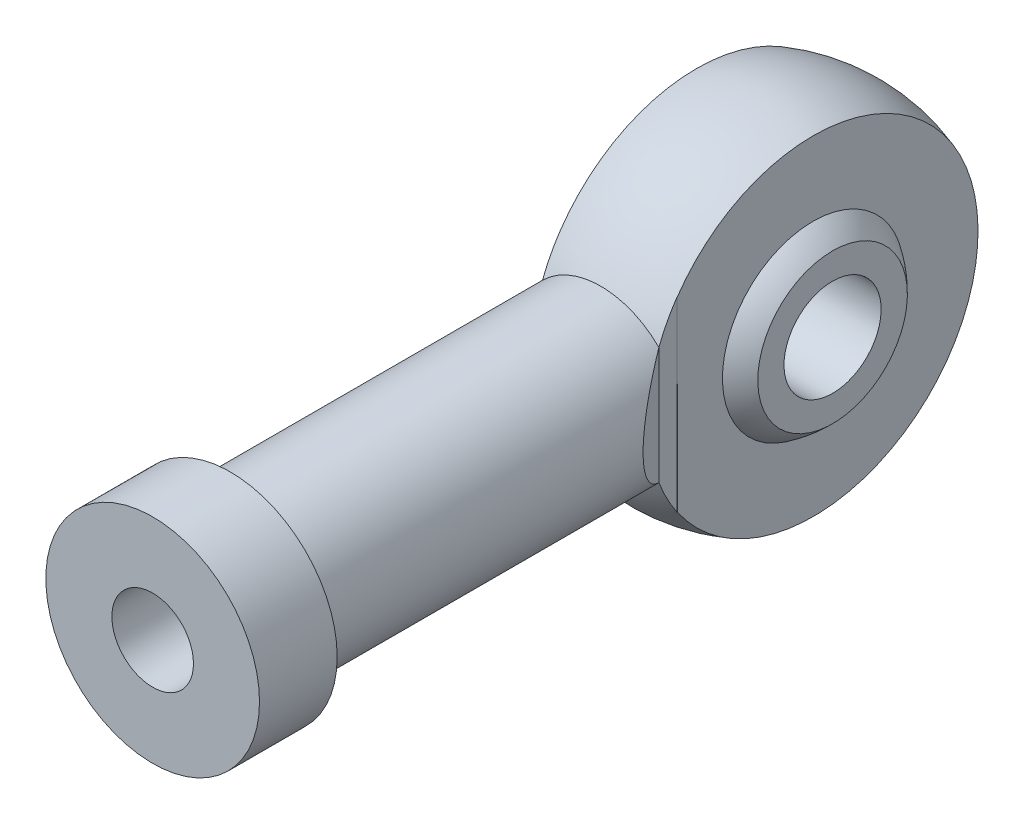
ISO-10303-21;
HEADER;
FILE_DESCRIPTION(('STEP AP214'),'2;1');
FILE_NAME('part.step','',(''),(''),'','','');
FILE_SCHEMA(('AUTOMOTIVE_DESIGN { 1 0 10303 214 1 1 1 1 }'));
ENDSEC;
DATA;
#1=APPLICATION_CONTEXT('core data for automotive mechanical design processes');
#2=APPLICATION_PROTOCOL_DEFINITION('international standard','automotive_design',2000,#1);
#3=PRODUCT_CONTEXT('',#1,'mechanical');
#4=PRODUCT('Part','Part','',(#3));
#5=PRODUCT_RELATED_PRODUCT_CATEGORY('part','',(#4));
#6=PRODUCT_DEFINITION_FORMATION('','',#4);
#7=PRODUCT_DEFINITION_CONTEXT('part definition',#1,'design');
#8=PRODUCT_DEFINITION('design','',#6,#7);
#9=PRODUCT_DEFINITION_SHAPE('','',#8);
#10=(LENGTH_UNIT() NAMED_UNIT(*) SI_UNIT(.MILLI.,.METRE.));
#11=(NAMED_UNIT(*) PLANE_ANGLE_UNIT() SI_UNIT($,.RADIAN.));
#12=(NAMED_UNIT(*) SI_UNIT($,.STERADIAN.) SOLID_ANGLE_UNIT());
#13=UNCERTAINTY_MEASURE_WITH_UNIT(LENGTH_MEASURE(1.E-05),#10,'distance_accuracy_value','');
#14=(GEOMETRIC_REPRESENTATION_CONTEXT(3) GLOBAL_UNCERTAINTY_ASSIGNED_CONTEXT((#13)) GLOBAL_UNIT_ASSIGNED_CONTEXT((#10,
#11,#12)) REPRESENTATION_CONTEXT('',''));
#15=CARTESIAN_POINT('',(0.,0.,0.));
#16=DIRECTION('',(0.,0.,1.));
#17=DIRECTION('',(1.,0.,0.));
#18=AXIS2_PLACEMENT_3D('',#15,#16,#17);
#19=CARTESIAN_POINT('',(-2.99065769581719,-0.00329144068268788,0.));
#20=DIRECTION('',(0.999999394368772,0.00110057352731877,0.));
#21=DIRECTION('',(-0.00110057352731877,0.999999394368772,0.));
#22=AXIS2_PLACEMENT_3D('',#19,#20,#21);
#23=CONICAL_SURFACE('',#22,8.48857795586915,1.5696957530454);
#24=CARTESIAN_POINT('',(-2.98587767050593,-4.50986404126184,6.99999999999999));
#25=CARTESIAN_POINT('',(-2.98696704089088,-3.86904866982626,6.99999999999999));
#26=CARTESIAN_POINT('',(-2.98799511268696,-3.22823318379778,6.99999999999999));
#27=CARTESIAN_POINT('',(-2.98989243643355,-1.94660198497909,6.99999999999999));
#28=CARTESIAN_POINT('',(-2.99076168838577,-1.30578627218888,6.99999999999999));
#29=CARTESIAN_POINT('',(-2.99230514964899,-0.0241547354105878,6.99999999999999));
#30=CARTESIAN_POINT('',(-2.99297935899859,0.616661088577456,6.99999999999999));
#31=CARTESIAN_POINT('',(-2.99413983267879,1.89829290344786,6.99999999999999));
#32=CARTESIAN_POINT('',(-2.99462609700943,2.53910889433022,6.99999999999999));
#33=CARTESIAN_POINT('',(-2.99586836539569,4.4615568562803,6.99999999999999));
#34=CARTESIAN_POINT('',(-2.99640784500371,5.74318896076301,6.99999999999999));
#35=CARTESIAN_POINT('',(-2.99722802226726,8.30645339784344,6.99999999999999));
#36=CARTESIAN_POINT('',(-2.99750871988829,9.58808573044116,6.99999999999999));
#37=CARTESIAN_POINT('',(-2.9981832328712,13.4162925804174,6.99999999999999));
#38=CARTESIAN_POINT('',(-2.99841525848541,15.962867125722,6.99999999999999));
#39=CARTESIAN_POINT('',(-2.99876899653975,21.0560162274157,6.99999999999999));
#40=CARTESIAN_POINT('',(-2.99889070897936,23.6025907838048,6.99999999999999));
#41=CARTESIAN_POINT('',(-2.99908289041489,28.6957384884072,6.99999999999999));
#42=CARTESIAN_POINT('',(-2.99915335943921,31.2423116366205,6.99999999999999));
#43=CARTESIAN_POINT('',(-2.9992675268632,36.3354579145907,6.99999999999999));
#44=CARTESIAN_POINT('',(-2.99931122526307,38.8820310443476,6.99999999999999));
#45=CARTESIAN_POINT('',(-2.99935377470547,41.4286041730237,6.99999999999999));
#46=B_SPLINE_CURVE_WITH_KNOTS('',3,(#24,#25,#26,#27,#28,#29,#30,#31,#32,#33,#34,#35,#36,#37,#38,
#39,#40,#41,#42,#43,#44,#45),.UNSPECIFIED.,.F.,.F.,(4,2,2,2,2,2,2,2,2,2,4),(0.,1.92244890536118,
3.84489779014671,5.76734629436151,7.68979479809854,11.5346913732364,15.3795884611671,
23.0193121075204,30.6590357889017,38.2987552354128,45.9384746246257),.UNSPECIFIED.);
#47=CARTESIAN_POINT('',(-2.99594227764374,4.79836741705207,6.99999999999999));
#48=VERTEX_POINT('',#47);
#49=CARTESIAN_POINT('',(-2.99493247749547,3.01544017603445,6.99999999999999));
#50=VERTEX_POINT('',#49);
#51=EDGE_CURVE('E176',#48,#50,#46,.F.);
#52=ORIENTED_EDGE('',*,*,#51,.F.);
#53=CARTESIAN_POINT('',(-2.99065769581719,-0.00329144068268788,0.));
#54=DIRECTION('',(0.999999394368772,0.00110057352731877,0.));
#55=DIRECTION('',(-0.00110057352731877,0.999999394368772,0.));
#56=AXIS2_PLACEMENT_3D('',#53,#54,#55);
#57=CIRCLE('',#56,8.48857795586915);
#58=CARTESIAN_POINT('',(-2.98733431806022,-3.02296769287065,7.93331582631121));
#59=VERTEX_POINT('',#58);
#60=EDGE_CURVE('E260',#59,#48,#57,.T.);
#61=ORIENTED_EDGE('',*,*,#60,.F.);
#62=CARTESIAN_POINT('',(-2.9866050355156,-3.02368820512844,8.63763575145607));
#63=CARTESIAN_POINT('',(-2.98691527374126,-3.02338176898465,8.33985350291747));
#64=CARTESIAN_POINT('',(-2.98722317419889,-3.02307755174879,8.04207124972971));
#65=CARTESIAN_POINT('',(-2.98783429957813,-3.02247355509293,7.44650673404871));
#66=CARTESIAN_POINT('',(-2.98813752449973,-3.02217377567294,7.14872447155548));
#67=CARTESIAN_POINT('',(-2.98843841165331,-3.02187621516088,6.85094220441308));
#68=B_SPLINE_CURVE_WITH_KNOTS('',3,(#62,#63,#64,#65,#66,#67),.UNSPECIFIED.,.F.,.F.,(4,2,4),(0.,
0.893347703293407,1.78669540660818),.UNSPECIFIED.);
#69=CARTESIAN_POINT('',(-2.98828779895705,-3.02202515386693,6.99999999999999));
#70=VERTEX_POINT('',#69);
#71=EDGE_CURVE('E232',#59,#70,#68,.T.);
#72=ORIENTED_EDGE('',*,*,#71,.T.);
#73=CARTESIAN_POINT('',(-2.97379861716255,-10.877684637419,6.99999999999999));
#74=CARTESIAN_POINT('',(-2.97635712662216,-9.59598682161832,6.99999999999999));
#75=CARTESIAN_POINT('',(-2.97892320568871,-8.31428896298168,6.99999999999999));
#76=CARTESIAN_POINT('',(-2.98376835514571,-5.75089287020575,6.99999999999999));
#77=CARTESIAN_POINT('',(-2.98604742557103,-4.46919463606651,6.99999999999999));
#78=CARTESIAN_POINT('',(-2.99001641095492,-1.9057969773286,6.99999999999999));
#79=CARTESIAN_POINT('',(-2.99170632581525,-0.624097552729756,6.99999999999999));
#80=CARTESIAN_POINT('',(-2.99427185308603,1.93930217772501,6.99999999999999));
#81=CARTESIAN_POINT('',(-2.99514746544313,3.22100248358098,6.99999999999999));
#82=CARTESIAN_POINT('',(-2.99644317077067,5.77771312742276,6.99999999999999));
#83=CARTESIAN_POINT('',(-2.99686561757702,7.05272346450061,6.99999999999999));
#84=CARTESIAN_POINT('',(-2.99752052082259,9.60274419811214,6.99999999999999));
#85=CARTESIAN_POINT('',(-2.99775297725966,10.8777545946458,6.99999999999999));
#86=CARTESIAN_POINT('',(-2.99812778265043,13.4277751853676,6.99999999999999));
#87=CARTESIAN_POINT('',(-2.99827013161921,14.7027853795558,6.99999999999999));
#88=CARTESIAN_POINT('',(-2.99850334633731,17.252805733344,6.99999999999999));
#89=CARTESIAN_POINT('',(-2.99859421208823,18.527815892944,6.99999999999999));
#90=CARTESIAN_POINT('',(-2.99867864833403,19.8028260520173,6.99999999999999));
#91=B_SPLINE_CURVE_WITH_KNOTS('',3,(#73,#74,#75,#76,#77,#78,#79,#80,#81,#82,#83,#84,#85,#86,#87,
#88,#89,#90),.UNSPECIFIED.,.F.,.F.,(4,2,2,2,2,2,2,2,4),(0.,3.84510120546921,7.69020194382671,
11.5353033233419,15.3804049547153,19.2054361569159,23.0304674025207,26.8554980081179,
30.6805284950457),.UNSPECIFIED.);
#92=EDGE_CURVE('E217',#50,#70,#91,.F.);
#93=ORIENTED_EDGE('',*,*,#92,.F.);
#94=EDGE_LOOP('',(#52,#61,#72,#93));
#95=FACE_BOUND('',#94,.T.);
#96=CARTESIAN_POINT('',(-2.99485090559737,-0.00329605562116139,0.));
#97=DIRECTION('',(0.999999394368772,0.00110057352731877,0.));
#98=DIRECTION('',(-0.00110057352731877,0.999999394368772,0.));
#99=AXIS2_PLACEMENT_3D('',#96,#97,#98);
#100=CIRCLE('',#99,4.67855556654615);
#101=CARTESIAN_POINT('',(-3.,4.67525667744563,0.));
#102=VERTEX_POINT('',#101);
#103=EDGE_CURVE('E266',#102,#102,#100,.T.);
#104=ORIENTED_EDGE('',*,*,#103,.T.);
#105=EDGE_LOOP('',(#104));
#106=FACE_BOUND('',#105,.T.);
#107=ADVANCED_FACE('F38',(#95,#106),#23,.T.);
#108=CARTESIAN_POINT('',(3.0051418268301,0.00330738154350106,0.));
#109=DIRECTION('',(0.999999394368772,0.00110057352731877,0.));
#110=DIRECTION('',(-0.00110057352731877,0.999999394368772,0.));
#111=AXIS2_PLACEMENT_3D('',#108,#109,#110);
#112=CONICAL_SURFACE('',#111,4.67195212538224,1.5696957530454);
#113=CARTESIAN_POINT('',(3.04026645925843,-17.6204222066128,6.99999999999999));
#114=CARTESIAN_POINT('',(3.03788491929923,-16.4970888417773,6.99999999999999));
#115=CARTESIAN_POINT('',(3.03551138726321,-15.3737554581972,6.99999999999999));
#116=CARTESIAN_POINT('',(3.03081708698999,-13.12708846677,6.99999999999999));
#117=CARTESIAN_POINT('',(3.02849631875816,-12.003754858923,6.99999999999999));
#118=CARTESIAN_POINT('',(3.02362250544488,-9.59826732993797,6.99999999999999));
#119=CARTESIAN_POINT('',(3.0210830104967,-8.31611338118396,6.99999999999999));
#120=CARTESIAN_POINT('',(3.01625541273942,-5.7518050809759,6.99999999999999));
#121=CARTESIAN_POINT('',(3.01396730991322,-4.46965072952189,6.99999999999999));
#122=CARTESIAN_POINT('',(3.00998941226899,-1.90534084194531,6.99999999999999));
#123=CARTESIAN_POINT('',(3.00829961754285,-0.623185305822602,6.99999999999999));
#124=CARTESIAN_POINT('',(3.00573264791389,1.94112661206625,6.99999999999999));
#125=CARTESIAN_POINT('',(3.00485547304258,3.22328299383242,6.99999999999999));
#126=CARTESIAN_POINT('',(3.00355803207283,5.78044955937465,6.99999999999999));
#127=CARTESIAN_POINT('',(3.0031352465461,7.05545974217479,6.99999999999999));
#128=CARTESIAN_POINT('',(3.00248061087516,9.60548016187929,6.99999999999999));
#129=CARTESIAN_POINT('',(3.00224876073232,10.8804903987837,6.99999999999999));
#130=CARTESIAN_POINT('',(3.00168304274492,14.7055212393151,6.99999999999999));
#131=CARTESIAN_POINT('',(3.00147900737371,17.2555418590416,6.99999999999999));
#132=CARTESIAN_POINT('',(3.00118256639453,22.0577715207377,6.99999999999999));
#133=CARTESIAN_POINT('',(3.00107990670306,24.3099805624441,6.99999999999999));
#134=CARTESIAN_POINT('',(3.00091651603292,28.8143984707163,6.99999999999999));
#135=CARTESIAN_POINT('',(3.00085578505095,31.0666073372821,6.99999999999999));
#136=CARTESIAN_POINT('',(3.00080061391159,33.3188162045301,6.99999999999999));
#137=B_SPLINE_CURVE_WITH_KNOTS('',3,(#113,#114,#115,#116,#117,#118,#119,#120,#121,#122,#123,
#124,#125,#126,#127,#128,#129,#130,#131,#132,#133,#134,#135,#136),.UNSPECIFIED.,.F.,.F.,(4,2,2,
2,2,2,2,2,2,2,2,4),(0.,3.37000767087777,6.74001568467636,10.5864850689445,14.4329541915297,
18.2794239047968,22.1258937672008,25.9509245063626,29.7759552730669,37.4260171476329,
44.1826442803645,50.9392708828254),.UNSPECIFIED.);
#138=CARTESIAN_POINT('',(3.01460675987241,-4.78666335596433,6.99999999999999));
#139=VERTEX_POINT('',#138);
#140=CARTESIAN_POINT('',(3.00406331334815,4.79328734892828,6.99999999999999));
#141=VERTEX_POINT('',#140);
#142=EDGE_CURVE('E195',#139,#141,#137,.T.);
#143=ORIENTED_EDGE('',*,*,#142,.F.);
#144=CARTESIAN_POINT('',(3.00933503661028,0.00331199648197457,0.));
#145=DIRECTION('',(0.999999394368772,0.00110057352731877,0.));
#146=DIRECTION('',(-0.00110057352731877,0.999999394368772,0.));
#147=AXIS2_PLACEMENT_3D('',#144,#145,#146);
#148=CIRCLE('',#147,8.48197451470523);
#149=EDGE_CURVE('E261',#139,#141,#148,.T.);
#150=ORIENTED_EDGE('',*,*,#149,.T.);
#151=EDGE_LOOP('',(#143,#150));
#152=FACE_BOUND('',#151,.T.);
#153=CARTESIAN_POINT('',(3.0051418268301,0.00330738154350106,0.));
#154=DIRECTION('',(0.999999394368772,0.00110057352731877,0.));
#155=DIRECTION('',(-0.00110057352731877,0.999999394368772,0.));
#156=AXIS2_PLACEMENT_3D('',#153,#154,#155);
#157=CIRCLE('',#156,4.67195212538224);
#158=CARTESIAN_POINT('',(3.,4.67525667744564,0.));
#159=VERTEX_POINT('',#158);
#160=EDGE_CURVE('E264',#159,#159,#157,.T.);
#161=ORIENTED_EDGE('',*,*,#160,.F.);
#162=EDGE_LOOP('',(#161));
#163=FACE_BOUND('',#162,.T.);
#164=ADVANCED_FACE('F204',(#152,#163),#112,.F.);
#165=CARTESIAN_POINT('',(0.,0.,0.));
#166=DIRECTION('',(0.999999394368772,0.00110057352731877,0.));
#167=DIRECTION('',(-0.00110057352731877,0.999999394368772,0.));
#168=AXIS2_PLACEMENT_3D('',#165,#166,#167);
#169=SPHERICAL_SURFACE('',#168,9.);
#170=CARTESIAN_POINT('',(2.99493247749547,0.,0.));
#171=DIRECTION('',(-1.,0.,0.));
#172=DIRECTION('',(0.,0.,1.));
#173=AXIS2_PLACEMENT_3D('',#170,#171,#172);
#174=CIRCLE('',#173,8.48707131201587);
#175=CARTESIAN_POINT('',(2.99493247749547,-3.01544017603448,7.93331582631121));
#176=VERTEX_POINT('',#175);
#177=CARTESIAN_POINT('',(2.99493247749547,-4.7989977552863,6.99999999999999));
#178=VERTEX_POINT('',#177);
#179=EDGE_CURVE('E132',#176,#178,#174,.F.);
#180=ORIENTED_EDGE('',*,*,#179,.F.);
#181=CARTESIAN_POINT('',(0.,0.,7.93331582631121));
#182=DIRECTION('',(0.,0.,-1.));
#183=DIRECTION('',(-1.,0.,0.));
#184=AXIS2_PLACEMENT_3D('',#181,#182,#183);
#185=CIRCLE('',#184,4.25);
#186=EDGE_CURVE('E61',#176,#59,#185,.T.);
#187=ORIENTED_EDGE('',*,*,#186,.T.);
#188=ORIENTED_EDGE('',*,*,#60,.T.);
#189=CARTESIAN_POINT('',(0.,0.,6.99999999999999));
#190=DIRECTION('',(0.,0.,-1.));
#191=DIRECTION('',(-1.,0.,0.));
#192=AXIS2_PLACEMENT_3D('',#189,#190,#191);
#193=CIRCLE('',#192,5.65685424949239);
#194=CARTESIAN_POINT('',(-2.99493247749547,4.79899775528629,6.99999999999999));
#195=VERTEX_POINT('',#194);
#196=EDGE_CURVE('E181',#195,#48,#193,.F.);
#197=ORIENTED_EDGE('',*,*,#196,.F.);
#198=CARTESIAN_POINT('',(-2.99493247749547,0.,0.));
#199=DIRECTION('',(1.,0.,0.));
#200=DIRECTION('',(0.,0.,-1.));
#201=AXIS2_PLACEMENT_3D('',#198,#199,#200);
#202=CIRCLE('',#201,8.48707131201587);
#203=CARTESIAN_POINT('',(-2.99493247749547,3.880846223209,7.54780842675849));
#204=VERTEX_POINT('',#203);
#205=EDGE_CURVE('E150',#204,#195,#202,.F.);
#206=ORIENTED_EDGE('',*,*,#205,.F.);
#207=CARTESIAN_POINT('',(-2.99398107357416,3.01638481150527,7.93331582631121));
#208=VERTEX_POINT('',#207);
#209=EDGE_CURVE('E256',#204,#208,#57,.T.);
#210=ORIENTED_EDGE('',*,*,#209,.T.);
#211=CARTESIAN_POINT('',(2.99493247749547,3.01544017603447,7.93331582631121));
#212=VERTEX_POINT('',#211);
#213=EDGE_CURVE('E202',#208,#212,#185,.T.);
#214=ORIENTED_EDGE('',*,*,#213,.T.);
#215=CARTESIAN_POINT('',(2.99493247749547,4.7989977552863,6.99999999999999));
#216=VERTEX_POINT('',#215);
#217=EDGE_CURVE('E129',#216,#212,#174,.F.);
#218=ORIENTED_EDGE('',*,*,#217,.F.);
#219=CARTESIAN_POINT('',(0.,0.,6.99999999999999));
#220=DIRECTION('',(0.,0.,-1.));
#221=DIRECTION('',(-1.,0.,0.));
#222=AXIS2_PLACEMENT_3D('',#219,#220,#221);
#223=CIRCLE('',#222,5.65685424949239);
#224=EDGE_CURVE('E125',#141,#216,#223,.F.);
#225=ORIENTED_EDGE('',*,*,#224,.F.);
#226=ORIENTED_EDGE('',*,*,#149,.F.);
#227=EDGE_CURVE('E128',#178,#139,#223,.F.);
#228=ORIENTED_EDGE('',*,*,#227,.F.);
#229=EDGE_LOOP('',(#180,#187,#188,#197,#206,#210,#214,#218,#225,#226,#228));
#230=FACE_BOUND('',#229,.T.);
#231=ADVANCED_FACE('F259',(#230),#169,.T.);
#232=CARTESIAN_POINT('',(-2.99493247749547,0.744253087145943,5.29952192812903));
#233=CARTESIAN_POINT('',(-2.99493247749547,1.43164348018067,5.88803603499139));
#234=CARTESIAN_POINT('',(-2.99493247749547,2.15571924505364,6.42683335695496));
#235=CARTESIAN_POINT('',(-2.99493247749547,3.65184621188483,7.42548632285628));
#236=CARTESIAN_POINT('',(-2.99493247749547,4.42364261510994,7.88571896370447));
#237=CARTESIAN_POINT('',(-2.99493247749547,6.05180612930398,8.78328964114072));
#238=CARTESIAN_POINT('',(-2.99493247749547,6.91032027005502,9.21680330450003));
#239=CARTESIAN_POINT('',(-2.99493247749547,7.77280817402642,9.63379389818218));
#240=B_SPLINE_CURVE_WITH_KNOTS('',3,(#232,#233,#234,#235,#236,#237,#238,#239),.UNSPECIFIED.,.F.,
.F.,(4,2,2,4),(0.,2.70583672149586,5.39830022826054,8.27820465081111),.UNSPECIFIED.);
#241=EDGE_CURVE('E143',#50,#204,#240,.T.);
#242=ORIENTED_EDGE('',*,*,#241,.F.);
#243=CARTESIAN_POINT('',(-2.99508276199107,3.01529090616874,6.85094220441308));
#244=CARTESIAN_POINT('',(-2.99478253054045,3.01558912825643,7.14872447155548));
#245=CARTESIAN_POINT('',(-2.9944799662116,3.01588957439244,7.44650673404871));
#246=CARTESIAN_POINT('',(-2.99387017179748,3.01649491476112,8.04207124972971));
#247=CARTESIAN_POINT('',(-2.99356294171221,3.01679980899378,8.33985350291748));
#248=CARTESIAN_POINT('',(-2.99325337874872,3.01710692727476,8.63763575145607));
#249=B_SPLINE_CURVE_WITH_KNOTS('',3,(#243,#244,#245,#246,#247,#248),.UNSPECIFIED.,.F.,.F.,(4,2,
4),(0.,0.893347703314771,1.78669540660818),.UNSPECIFIED.);
#250=EDGE_CURVE('E224',#50,#208,#249,.T.);
#251=ORIENTED_EDGE('',*,*,#250,.T.);
#252=ORIENTED_EDGE('',*,*,#209,.F.);
#253=EDGE_LOOP('',(#242,#251,#252));
#254=FACE_BOUND('',#253,.T.);
#255=ADVANCED_FACE('F152',(#254),#23,.T.);
#256=CARTESIAN_POINT('',(0.,0.,0.));
#257=DIRECTION('',(0.999999394368772,0.00110057352731877,0.));
#258=DIRECTION('',(-0.00110057352731877,0.999999394368772,0.));
#259=AXIS2_PLACEMENT_3D('',#256,#257,#258);
#260=SPHERICAL_SURFACE('',#259,5.555);
#261=CARTESIAN_POINT('',(-3.99575287483343,-0.00439762249908713,0.));
#262=DIRECTION('',(0.999999394368772,0.00110057352731877,0.));
#263=DIRECTION('',(-0.00110057352731877,0.999999394368772,0.));
#264=AXIS2_PLACEMENT_3D('',#261,#262,#263);
#265=CIRCLE('',#264,3.85901083493902);
#266=CARTESIAN_POINT('',(-4.,3.85461087530246,0.));
#267=VERTEX_POINT('',#266);
#268=EDGE_CURVE('E225',#267,#267,#265,.T.);
#269=CARTESIAN_POINT('',(-4.,3.85461087530246,0.));
#270=CARTESIAN_POINT('',(-3.99062828487077,3.86433607635569,0.));
#271=CARTESIAN_POINT('',(-3.98122110109789,3.87402709793751,0.));
#272=CARTESIAN_POINT('',(-3.96233629968928,3.89334026947852,0.));
#273=CARTESIAN_POINT('',(-3.95285868205356,3.9029624194377,0.));
#274=CARTESIAN_POINT('',(-3.93383351634373,3.92213733505357,0.));
#275=CARTESIAN_POINT('',(-3.92428596826963,3.93169010071025,0.));
#276=CARTESIAN_POINT('',(-3.90512144983192,3.95072573971433,0.));
#277=CARTESIAN_POINT('',(-3.8955044794683,3.96020861306174,0.));
#278=CARTESIAN_POINT('',(-3.87620162802468,3.97910396289573,0.));
#279=CARTESIAN_POINT('',(-3.86651574694468,3.98851643938232,0.));
#280=CARTESIAN_POINT('',(-3.84707558937963,4.00727049475883,0.));
#281=CARTESIAN_POINT('',(-3.83732131289459,4.01661207364875,0.));
#282=CARTESIAN_POINT('',(-3.81774488345014,4.03522383684895,0.));
#283=CARTESIAN_POINT('',(-3.80792273049074,4.04449402115923,0.));
#284=CARTESIAN_POINT('',(-3.78821107064456,4.06296250202051,0.));
#285=CARTESIAN_POINT('',(-3.77832156375777,4.07216079857151,0.));
#286=CARTESIAN_POINT('',(-3.75847572218564,4.09048501455771,0.));
#287=CARTESIAN_POINT('',(-3.74851938750031,4.09961093399291,0.));
#288=CARTESIAN_POINT('',(-3.7285404200156,4.11778991024186,0.));
#289=CARTESIAN_POINT('',(-3.71851778721622,4.12684296705561,0.));
#290=CARTESIAN_POINT('',(-3.69840675671495,4.14487573643228,0.));
#291=CARTESIAN_POINT('',(-3.68831835901306,4.15385544899519,0.));
#292=CARTESIAN_POINT('',(-3.66807633541704,4.17174105214278,0.));
#293=CARTESIAN_POINT('',(-3.65792270952291,4.18064694272745,0.));
#294=CARTESIAN_POINT('',(-3.63755076972289,4.19838442811854,0.));
#295=CARTESIAN_POINT('',(-3.62733245581699,4.20721602292496,0.));
#296=CARTESIAN_POINT('',(-3.60683168361535,4.2248044469121,0.));
#297=CARTESIAN_POINT('',(-3.59654922531961,4.23356127609283,0.));
#298=CARTESIAN_POINT('',(-3.57592071137273,4.25099970295875,0.));
#299=CARTESIAN_POINT('',(-3.56557465572159,4.25968130064395,0.));
#300=CARTESIAN_POINT('',(-3.54481949748178,4.27696880265134,0.));
#301=CARTESIAN_POINT('',(-3.53441039489312,4.28557470697353,0.));
#302=CARTESIAN_POINT('',(-3.51352969655029,4.3027103644144,0.));
#303=CARTESIAN_POINT('',(-3.50305810079612,4.31124011753306,0.));
#304=CARTESIAN_POINT('',(-3.48205297321898,4.32822301877764,0.));
#305=CARTESIAN_POINT('',(-3.47151944139601,4.33667616690356,0.));
#306=CARTESIAN_POINT('',(-3.45039100207302,4.35350540844884,0.));
#307=CARTESIAN_POINT('',(-3.439796094573,4.36188150186822,0.));
#308=CARTESIAN_POINT('',(-3.41854546755288,4.37855618838601,0.));
#309=CARTESIAN_POINT('',(-3.40788974803279,4.38685478148443,0.));
#310=CARTESIAN_POINT('',(-3.38651806386474,4.40337402586898,0.));
#311=CARTESIAN_POINT('',(-3.3758020992168,4.41159467715511,0.));
#312=CARTESIAN_POINT('',(-3.35431049489037,4.42795760057029,0.));
#313=CARTESIAN_POINT('',(-3.34353485521188,4.43609987269934,0.));
#314=CARTESIAN_POINT('',(-3.32192447409643,4.45230560462542,0.));
#315=CARTESIAN_POINT('',(-3.31108973265947,4.46036906442245,0.));
#316=CARTESIAN_POINT('',(-3.28936172444341,4.47641674270242,0.));
#317=CARTESIAN_POINT('',(-3.27846845766431,4.48440096118537,0.));
#318=CARTESIAN_POINT('',(-3.25662397829382,4.50028973207073,0.));
#319=CARTESIAN_POINT('',(-3.24567276570244,4.50819428447314,0.));
#320=CARTESIAN_POINT('',(-3.22371297732029,4.52392330266966,0.));
#321=CARTESIAN_POINT('',(-3.21270440152953,4.53174776846378,0.));
#322=CARTESIAN_POINT('',(-3.19063047241222,4.54731619717504,0.));
#323=CARTESIAN_POINT('',(-3.17956511908568,4.55506016009219,0.));
#324=CARTESIAN_POINT('',(-3.15737822358498,4.57046717106967,0.));
#325=CARTESIAN_POINT('',(-3.14625668141083,4.57813021913001,0.));
#326=CARTESIAN_POINT('',(-3.12395799987761,4.59337499269617,0.));
#327=CARTESIAN_POINT('',(-3.11278086051855,4.600956718202,0.));
#328=CARTESIAN_POINT('',(-3.09037157929109,4.61603844337228,0.));
#329=CARTESIAN_POINT('',(-3.07913943742269,4.62353844303675,0.));
#330=CARTESIAN_POINT('',(-3.05662074857281,4.63845631727015,0.));
#331=CARTESIAN_POINT('',(-3.04533420159132,4.6458741918391,0.));
#332=CARTESIAN_POINT('',(-3.02270730357286,4.66062742217273,0.));
#333=CARTESIAN_POINT('',(-3.0113669525359,4.66796277793743,0.));
#334=CARTESIAN_POINT('',(-3.,4.67525667744563,0.));
#335=B_SPLINE_CURVE_WITH_KNOTS('',3,(#269,#270,#271,#272,#273,#274,#275,#276,#277,#278,#279,
#280,#281,#282,#283,#284,#285,#286,#287,#288,#289,#290,#291,#292,#293,#294,#295,#296,#297,#298,
#299,#300,#301,#302,#303,#304,#305,#306,#307,#308,#309,#310,#311,#312,#313,#314,#315,#316,#317,
#318,#319,#320,#321,#322,#323,#324,#325,#326,#327,#328,#329,#330,#331,#332,#333,#334),
.UNSPECIFIED.,.F.,.F.,(4,2,2,2,2,2,2,2,2,2,2,2,2,2,2,2,2,2,2,2,2,2,2,2,2,2,2,2,2,2,2,2,4),(0.,
0.0405175263319651,0.0810350526639306,0.121552578995896,0.162070105327861,0.202587631659826,
0.243105157991792,0.283622684323757,0.324140210655722,0.364657736987687,0.405175263319652,
0.445692789651618,0.486210315983583,0.526727842315548,0.567245368647513,0.607762894979479,
0.648280421311444,0.688797947643409,0.729315473975375,0.76983300030734,0.810350526639305,
0.85086805297127,0.891385579303235,0.931903105635201,0.972420631967166,1.01293815829913,
1.0534556846311,1.09397321096306,1.13449073729503,1.17500826362699,1.21552578995896,
1.25604331629092,1.29656084262289),.UNSPECIFIED.);
#336=EDGE_CURVE('BSEAM40',#267,#102,#335,.T.);
#337=ORIENTED_EDGE('',*,*,#268,.T.);
#338=ORIENTED_EDGE('',*,*,#103,.F.);
#339=ORIENTED_EDGE('',*,*,#336,.T.);
#340=ORIENTED_EDGE('',*,*,#336,.F.);
#341=EDGE_LOOP('',(#337,#339,#338,#340));
#342=FACE_BOUND('',#341,.T.);
#343=ADVANCED_FACE('F40',(#342),#260,.T.);
#344=CARTESIAN_POINT('',(-3.99575287483343,-0.00439762249908713,0.));
#345=DIRECTION('',(0.999999394368772,0.00110057352731877,0.));
#346=DIRECTION('',(-0.00110057352731877,0.999999394368772,0.));
#347=AXIS2_PLACEMENT_3D('',#344,#345,#346);
#348=CONICAL_SURFACE('',#347,3.85901083493902,1.56969575304539);
#349=CARTESIAN_POINT('',(-3.99724856618171,-0.00439926861838702,0.));
#350=DIRECTION('',(0.999999394368772,0.00110057352731877,0.));
#351=DIRECTION('',(-0.00110057352731877,0.999999394368772,0.));
#352=AXIS2_PLACEMENT_3D('',#349,#350,#351);
#353=CIRCLE('',#352,2.5);
#354=CARTESIAN_POINT('',(-4.,2.49559921730354,0.));
#355=VERTEX_POINT('',#354);
#356=EDGE_CURVE('E275',#355,#355,#353,.T.);
#357=ORIENTED_EDGE('',*,*,#356,.T.);
#358=EDGE_LOOP('',(#357));
#359=FACE_BOUND('',#358,.T.);
#360=ORIENTED_EDGE('',*,*,#268,.F.);
#361=EDGE_LOOP('',(#360));
#362=FACE_BOUND('',#361,.T.);
#363=ADVANCED_FACE('F284',(#359,#362),#348,.T.);
#364=CARTESIAN_POINT('',(3.99999515495165,0.00440229144310824,0.));
#365=DIRECTION('',(0.999999394368772,0.00110057352731877,0.));
#366=DIRECTION('',(-0.00110057352731877,0.999999394368772,0.));
#367=AXIS2_PLACEMENT_3D('',#364,#365,#366);
#368=CYLINDRICAL_SURFACE('',#367,2.5);
#369=CARTESIAN_POINT('',(4.0027514338183,0.00440532493249996,0.));
#370=DIRECTION('',(0.999999394368772,0.00110057352731877,0.));
#371=DIRECTION('',(-0.00110057352731877,0.999999394368772,0.));
#372=AXIS2_PLACEMENT_3D('',#369,#370,#371);
#373=CIRCLE('',#372,2.5);
#374=CARTESIAN_POINT('',(4.,2.50440381085443,0.));
#375=VERTEX_POINT('',#374);
#376=EDGE_CURVE('E273',#375,#375,#373,.T.);
#377=ORIENTED_EDGE('',*,*,#376,.T.);
#378=EDGE_LOOP('',(#377));
#379=FACE_BOUND('',#378,.T.);
#380=ORIENTED_EDGE('',*,*,#356,.F.);
#381=EDGE_LOOP('',(#380));
#382=FACE_BOUND('',#381,.T.);
#383=ADVANCED_FACE('F286',(#379,#382),#368,.F.);
#384=CARTESIAN_POINT('',(4.0027514338183,0.00440532493249996,0.));
#385=DIRECTION('',(0.999999394368772,0.00110057352731877,0.));
#386=DIRECTION('',(-0.00110057352731877,0.999999394368772,0.));
#387=AXIS2_PLACEMENT_3D('',#384,#385,#386);
#388=CONICAL_SURFACE('',#387,2.5,1.5696957530454);
#389=CARTESIAN_POINT('',(4.00423743506986,0.00440696038712947,0.));
#390=DIRECTION('',(0.999999394368772,0.00110057352731877,0.));
#391=DIRECTION('',(-0.00110057352731877,0.999999394368772,0.));
#392=AXIS2_PLACEMENT_3D('',#389,#390,#391);
#393=CIRCLE('',#392,3.85020624672047);
#394=CARTESIAN_POINT('',(4.,3.85461087530246,0.));
#395=VERTEX_POINT('',#394);
#396=EDGE_CURVE('E270',#395,#395,#393,.T.);
#397=ORIENTED_EDGE('',*,*,#396,.T.);
#398=EDGE_LOOP('',(#397));
#399=FACE_BOUND('',#398,.T.);
#400=ORIENTED_EDGE('',*,*,#376,.F.);
#401=EDGE_LOOP('',(#400));
#402=FACE_BOUND('',#401,.T.);
#403=ADVANCED_FACE('F291',(#399,#402),#388,.F.);
#404=CARTESIAN_POINT('',(0.,0.,0.));
#405=DIRECTION('',(0.999999394368772,0.00110057352731877,0.));
#406=DIRECTION('',(-0.00110057352731877,0.999999394368772,0.));
#407=AXIS2_PLACEMENT_3D('',#404,#405,#406);
#408=SPHERICAL_SURFACE('',#407,5.555);
#409=CARTESIAN_POINT('',(3.,4.67525667744564,0.));
#410=CARTESIAN_POINT('',(3.0113669525359,4.66796277793743,0.));
#411=CARTESIAN_POINT('',(3.02270730357286,4.66062742217274,0.));
#412=CARTESIAN_POINT('',(3.04533420159132,4.6458741918391,0.));
#413=CARTESIAN_POINT('',(3.0566207485728,4.63845631727015,0.));
#414=CARTESIAN_POINT('',(3.07913943742269,4.62353844303675,0.));
#415=CARTESIAN_POINT('',(3.09037157929109,4.61603844337229,0.));
#416=CARTESIAN_POINT('',(3.11278086051855,4.600956718202,0.));
#417=CARTESIAN_POINT('',(3.12395799987761,4.59337499269618,0.));
#418=CARTESIAN_POINT('',(3.14625668141083,4.57813021913001,0.));
#419=CARTESIAN_POINT('',(3.15737822358498,4.57046717106967,0.));
#420=CARTESIAN_POINT('',(3.17956511908568,4.55506016009219,0.));
#421=CARTESIAN_POINT('',(3.19063047241222,4.54731619717505,0.));
#422=CARTESIAN_POINT('',(3.21270440152953,4.53174776846379,0.));
#423=CARTESIAN_POINT('',(3.22371297732029,4.52392330266966,0.));
#424=CARTESIAN_POINT('',(3.24567276570244,4.50819428447314,0.));
#425=CARTESIAN_POINT('',(3.25662397829382,4.50028973207073,0.));
#426=CARTESIAN_POINT('',(3.2784684576643,4.48440096118538,0.));
#427=CARTESIAN_POINT('',(3.2893617244434,4.47641674270243,0.));
#428=CARTESIAN_POINT('',(3.31108973265947,4.46036906442245,0.));
#429=CARTESIAN_POINT('',(3.32192447409643,4.45230560462542,0.));
#430=CARTESIAN_POINT('',(3.34353485521188,4.43609987269934,0.));
#431=CARTESIAN_POINT('',(3.35431049489036,4.42795760057029,0.));
#432=CARTESIAN_POINT('',(3.3758020992168,4.41159467715511,0.));
#433=CARTESIAN_POINT('',(3.38651806386474,4.40337402586898,0.));
#434=CARTESIAN_POINT('',(3.40788974803278,4.38685478148443,0.));
#435=CARTESIAN_POINT('',(3.41854546755288,4.37855618838601,0.));
#436=CARTESIAN_POINT('',(3.439796094573,4.36188150186822,0.));
#437=CARTESIAN_POINT('',(3.45039100207302,4.35350540844884,0.));
#438=CARTESIAN_POINT('',(3.47151944139601,4.33667616690356,0.));
#439=CARTESIAN_POINT('',(3.48205297321898,4.32822301877765,0.));
#440=CARTESIAN_POINT('',(3.50305810079612,4.31124011753307,0.));
#441=CARTESIAN_POINT('',(3.51352969655028,4.3027103644144,0.));
#442=CARTESIAN_POINT('',(3.53441039489312,4.28557470697354,0.));
#443=CARTESIAN_POINT('',(3.54481949748178,4.27696880265134,0.));
#444=CARTESIAN_POINT('',(3.56557465572158,4.25968130064395,0.));
#445=CARTESIAN_POINT('',(3.57592071137273,4.25099970295875,0.));
#446=CARTESIAN_POINT('',(3.59654922531961,4.23356127609283,0.));
#447=CARTESIAN_POINT('',(3.60683168361535,4.2248044469121,0.));
#448=CARTESIAN_POINT('',(3.62733245581699,4.20721602292496,0.));
#449=CARTESIAN_POINT('',(3.63755076972288,4.19838442811854,0.));
#450=CARTESIAN_POINT('',(3.65792270952291,4.18064694272745,0.));
#451=CARTESIAN_POINT('',(3.66807633541704,4.17174105214278,0.));
#452=CARTESIAN_POINT('',(3.68831835901306,4.15385544899519,0.));
#453=CARTESIAN_POINT('',(3.69840675671495,4.14487573643228,0.));
#454=CARTESIAN_POINT('',(3.71851778721622,4.12684296705561,0.));
#455=CARTESIAN_POINT('',(3.72854042001559,4.11778991024186,0.));
#456=CARTESIAN_POINT('',(3.7485193875003,4.09961093399291,0.));
#457=CARTESIAN_POINT('',(3.75847572218564,4.09048501455771,0.));
#458=CARTESIAN_POINT('',(3.77832156375777,4.07216079857151,0.));
#459=CARTESIAN_POINT('',(3.78821107064456,4.06296250202051,0.));
#460=CARTESIAN_POINT('',(3.80792273049074,4.04449402115923,0.));
#461=CARTESIAN_POINT('',(3.81774488345014,4.03522383684895,0.));
#462=CARTESIAN_POINT('',(3.83732131289459,4.01661207364875,0.));
#463=CARTESIAN_POINT('',(3.84707558937963,4.00727049475884,0.));
#464=CARTESIAN_POINT('',(3.86651574694468,3.98851643938233,0.));
#465=CARTESIAN_POINT('',(3.87620162802468,3.97910396289573,0.));
#466=CARTESIAN_POINT('',(3.8955044794683,3.96020861306174,0.));
#467=CARTESIAN_POINT('',(3.90512144983192,3.95072573971434,0.));
#468=CARTESIAN_POINT('',(3.92428596826963,3.93169010071025,0.));
#469=CARTESIAN_POINT('',(3.93383351634373,3.92213733505357,0.));
#470=CARTESIAN_POINT('',(3.95285868205355,3.9029624194377,0.));
#471=CARTESIAN_POINT('',(3.96233629968928,3.89334026947852,0.));
#472=CARTESIAN_POINT('',(3.98122110109788,3.87402709793751,0.));
#473=CARTESIAN_POINT('',(3.99062828487077,3.86433607635569,0.));
#474=CARTESIAN_POINT('',(4.,3.85461087530246,0.));
#475=B_SPLINE_CURVE_WITH_KNOTS('',3,(#409,#410,#411,#412,#413,#414,#415,#416,#417,#418,#419,
#420,#421,#422,#423,#424,#425,#426,#427,#428,#429,#430,#431,#432,#433,#434,#435,#436,#437,#438,
#439,#440,#441,#442,#443,#444,#445,#446,#447,#448,#449,#450,#451,#452,#453,#454,#455,#456,#457,
#458,#459,#460,#461,#462,#463,#464,#465,#466,#467,#468,#469,#470,#471,#472,#473,#474),
.UNSPECIFIED.,.F.,.F.,(4,2,2,2,2,2,2,2,2,2,2,2,2,2,2,2,2,2,2,2,2,2,2,2,2,2,2,2,2,2,2,2,4),(0.,
0.0405175263319646,0.0810350526639301,0.121552578995896,0.162070105327861,0.202587631659826,
0.243105157991791,0.283622684323757,0.324140210655722,0.364657736987687,0.405175263319652,
0.445692789651617,0.486210315983583,0.526727842315548,0.567245368647515,0.607762894979478,
0.648280421311444,0.688797947643409,0.729315473975375,0.76983300030734,0.810350526639305,
0.85086805297127,0.891385579303235,0.9319031056352,0.972420631967166,1.01293815829913,
1.0534556846311,1.09397321096306,1.13449073729503,1.17500826362699,1.21552578995896,
1.25604331629092,1.29656084262289),.UNSPECIFIED.);
#476=EDGE_CURVE('BSEAM339',#159,#395,#475,.T.);
#477=ORIENTED_EDGE('',*,*,#160,.T.);
#478=ORIENTED_EDGE('',*,*,#396,.F.);
#479=ORIENTED_EDGE('',*,*,#476,.T.);
#480=ORIENTED_EDGE('',*,*,#476,.F.);
#481=EDGE_LOOP('',(#477,#479,#478,#480));
#482=FACE_BOUND('',#481,.T.);
#483=ADVANCED_FACE('F339',(#482),#408,.T.);
#484=CARTESIAN_POINT('',(0.,0.,6.99999999999999));
#485=DIRECTION('',(0.,0.,1.));
#486=DIRECTION('',(1.,0.,0.));
#487=AXIS2_PLACEMENT_3D('',#484,#485,#486);
#488=CYLINDRICAL_SURFACE('',#487,4.25);
#489=CARTESIAN_POINT('',(0.,0.,3.00164526554736));
#490=DIRECTION('',(-0.854733389196251,0.,0.519067272512042));
#491=DIRECTION('',(0.519067272512042,0.,0.854733389196251));
#492=AXIS2_PLACEMENT_3D('',#489,#490,#491);
#493=ELLIPSE('',#492,8.18776336915251,4.25);
#494=EDGE_CURVE('E11',#176,#212,#493,.T.);
#495=ORIENTED_EDGE('',*,*,#494,.T.);
#496=ORIENTED_EDGE('',*,*,#213,.F.);
#497=ORIENTED_EDGE('',*,*,#250,.F.);
#498=DIRECTION('',(0.,0.,1.));
#499=VECTOR('',#498,1.);
#500=CARTESIAN_POINT('',(-2.99493247749547,3.01544017603448,6.99999999999999));
#501=LINE('',#500,#499);
#502=CARTESIAN_POINT('',(-2.99493247749547,3.01544017603447,7.93331582631121));
#503=VERTEX_POINT('',#502);
#504=EDGE_CURVE('E140',#50,#503,#501,.T.);
#505=ORIENTED_EDGE('',*,*,#504,.T.);
#506=CARTESIAN_POINT('',(0.,0.,3.00164526554736));
#507=DIRECTION('',(0.854733389196251,0.,0.519067272512042));
#508=DIRECTION('',(-0.519067272512042,0.,0.854733389196251));
#509=AXIS2_PLACEMENT_3D('',#506,#507,#508);
#510=ELLIPSE('',#509,8.18776336915251,4.25);
#511=CARTESIAN_POINT('',(-2.99493247749547,-3.01544017603448,7.93331582631121));
#512=VERTEX_POINT('',#511);
#513=EDGE_CURVE('E46',#503,#512,#510,.T.);
#514=ORIENTED_EDGE('',*,*,#513,.T.);
#515=DIRECTION('',(0.,0.,1.));
#516=VECTOR('',#515,1.);
#517=CARTESIAN_POINT('',(-2.99493247749547,-3.01544017603448,6.99999999999999));
#518=LINE('',#517,#516);
#519=CARTESIAN_POINT('',(-2.99493247749547,-3.01544017603448,6.99999999999999));
#520=VERTEX_POINT('',#519);
#521=EDGE_CURVE('E134',#512,#520,#518,.F.);
#522=ORIENTED_EDGE('',*,*,#521,.T.);
#523=CARTESIAN_POINT('',(0.,0.,6.99999999999999));
#524=DIRECTION('',(0.,0.,-1.));
#525=DIRECTION('',(-1.,0.,0.));
#526=AXIS2_PLACEMENT_3D('',#523,#524,#525);
#527=CIRCLE('',#526,4.25);
#528=EDGE_CURVE('E192',#70,#520,#527,.T.);
#529=ORIENTED_EDGE('',*,*,#528,.F.);
#530=ORIENTED_EDGE('',*,*,#71,.F.);
#531=ORIENTED_EDGE('',*,*,#186,.F.);
#532=EDGE_LOOP('',(#495,#496,#497,#505,#514,#522,#529,#530,#531));
#533=FACE_BOUND('',#532,.T.);
#534=CARTESIAN_POINT('',(0.,0.,27.));
#535=DIRECTION('',(0.,0.,1.));
#536=DIRECTION('',(1.,0.,0.));
#537=AXIS2_PLACEMENT_3D('',#534,#535,#536);
#538=CIRCLE('',#537,4.25);
#539=CARTESIAN_POINT('',(4.25,0.,27.));
#540=VERTEX_POINT('',#539);
#541=EDGE_CURVE('E187',#540,#540,#538,.T.);
#542=ORIENTED_EDGE('',*,*,#541,.F.);
#543=EDGE_LOOP('',(#542));
#544=FACE_BOUND('',#543,.T.);
#545=ADVANCED_FACE('F212',(#533,#544),#488,.T.);
#546=CARTESIAN_POINT('',(0.,0.,6.99999999999999));
#547=DIRECTION('',(0.,0.,-1.));
#548=DIRECTION('',(-1.,0.,0.));
#549=AXIS2_PLACEMENT_3D('',#546,#547,#548);
#550=PLANE('',#549);
#551=DIRECTION('',(0.,-1.,0.));
#552=VECTOR('',#551,1.);
#553=CARTESIAN_POINT('',(-2.99493247749547,0.,6.99999999999999));
#554=LINE('',#553,#552);
#555=EDGE_CURVE('E237',#50,#520,#554,.T.);
#556=ORIENTED_EDGE('',*,*,#555,.F.);
#557=ORIENTED_EDGE('',*,*,#92,.T.);
#558=ORIENTED_EDGE('',*,*,#528,.T.);
#559=EDGE_LOOP('',(#556,#557,#558));
#560=FACE_BOUND('',#559,.T.);
#561=ADVANCED_FACE('F207',(#560),#550,.T.);
#562=CARTESIAN_POINT('',(0.,0.,31.));
#563=DIRECTION('',(0.,0.,-1.));
#564=DIRECTION('',(-1.,0.,0.));
#565=AXIS2_PLACEMENT_3D('',#562,#563,#564);
#566=CYLINDRICAL_SURFACE('',#565,5.5);
#567=CARTESIAN_POINT('',(0.,0.,31.));
#568=DIRECTION('',(0.,0.,1.));
#569=DIRECTION('',(1.,0.,0.));
#570=AXIS2_PLACEMENT_3D('',#567,#568,#569);
#571=CIRCLE('',#570,5.5);
#572=CARTESIAN_POINT('',(5.5,0.,31.));
#573=VERTEX_POINT('',#572);
#574=EDGE_CURVE('E184',#573,#573,#571,.T.);
#575=ORIENTED_EDGE('',*,*,#574,.F.);
#576=EDGE_LOOP('',(#575));
#577=FACE_BOUND('',#576,.T.);
#578=CARTESIAN_POINT('',(0.,0.,27.));
#579=DIRECTION('',(0.,0.,1.));
#580=DIRECTION('',(1.,0.,0.));
#581=AXIS2_PLACEMENT_3D('',#578,#579,#580);
#582=CIRCLE('',#581,5.5);
#583=CARTESIAN_POINT('',(5.5,0.,27.));
#584=VERTEX_POINT('',#583);
#585=EDGE_CURVE('E183',#584,#584,#582,.T.);
#586=ORIENTED_EDGE('',*,*,#585,.T.);
#587=EDGE_LOOP('',(#586));
#588=FACE_BOUND('',#587,.T.);
#589=ADVANCED_FACE('F211',(#577,#588),#566,.T.);
#590=CARTESIAN_POINT('',(0.,0.,31.));
#591=DIRECTION('',(0.,0.,1.));
#592=DIRECTION('',(1.,0.,0.));
#593=AXIS2_PLACEMENT_3D('',#590,#591,#592);
#594=PLANE('',#593);
#595=CARTESIAN_POINT('',(0.,0.,31.));
#596=DIRECTION('',(0.,0.,1.));
#597=DIRECTION('',(1.,0.,0.));
#598=AXIS2_PLACEMENT_3D('',#595,#596,#597);
#599=CIRCLE('',#598,2.09999999999999);
#600=CARTESIAN_POINT('',(2.09999999999999,0.,31.));
#601=VERTEX_POINT('',#600);
#602=EDGE_CURVE('E116',#601,#601,#599,.T.);
#603=ORIENTED_EDGE('',*,*,#602,.F.);
#604=EDGE_LOOP('',(#603));
#605=FACE_BOUND('',#604,.T.);
#606=ORIENTED_EDGE('',*,*,#574,.T.);
#607=EDGE_LOOP('',(#606));
#608=FACE_BOUND('',#607,.T.);
#609=ADVANCED_FACE('F174',(#605,#608),#594,.T.);
#610=CARTESIAN_POINT('',(0.,0.,27.));
#611=DIRECTION('',(0.,0.,1.));
#612=DIRECTION('',(1.,0.,0.));
#613=AXIS2_PLACEMENT_3D('',#610,#611,#612);
#614=PLANE('',#613);
#615=ORIENTED_EDGE('',*,*,#541,.T.);
#616=EDGE_LOOP('',(#615));
#617=FACE_BOUND('',#616,.T.);
#618=ORIENTED_EDGE('',*,*,#585,.F.);
#619=EDGE_LOOP('',(#618));
#620=FACE_BOUND('',#619,.T.);
#621=ADVANCED_FACE('F162',(#617,#620),#614,.F.);
#622=CARTESIAN_POINT('',(-2.99493247749547,-10.,6.99999999999999));
#623=DIRECTION('',(1.,0.,0.));
#624=DIRECTION('',(0.,0.,-1.));
#625=AXIS2_PLACEMENT_3D('',#622,#623,#624);
#626=PLANE('',#625);
#627=ORIENTED_EDGE('',*,*,#555,.T.);
#628=ORIENTED_EDGE('',*,*,#521,.F.);
#629=DIRECTION('',(0.,1.,0.));
#630=VECTOR('',#629,1.);
#631=CARTESIAN_POINT('',(-2.99493247749547,-10.,7.93331582631121));
#632=LINE('',#631,#630);
#633=EDGE_CURVE('E135',#512,#503,#632,.T.);
#634=ORIENTED_EDGE('',*,*,#633,.T.);
#635=ORIENTED_EDGE('',*,*,#504,.F.);
#636=EDGE_LOOP('',(#627,#628,#634,#635));
#637=FACE_BOUND('',#636,.T.);
#638=ADVANCED_FACE('F156',(#637),#626,.F.);
#639=CARTESIAN_POINT('',(-2.99493247749547,-10.,7.93331582631121));
#640=DIRECTION('',(0.854733389196251,0.,0.519067272512042));
#641=DIRECTION('',(0.519067272512042,0.,-0.854733389196251));
#642=AXIS2_PLACEMENT_3D('',#639,#640,#641);
#643=PLANE('',#642);
#644=ORIENTED_EDGE('',*,*,#513,.F.);
#645=ORIENTED_EDGE('',*,*,#633,.F.);
#646=EDGE_LOOP('',(#644,#645));
#647=FACE_BOUND('',#646,.T.);
#648=ADVANCED_FACE('F161',(#647),#643,.F.);
#649=CARTESIAN_POINT('',(-4.25,-10.,6.99999999999999));
#650=DIRECTION('',(0.,0.,-1.));
#651=DIRECTION('',(-1.,0.,0.));
#652=AXIS2_PLACEMENT_3D('',#649,#650,#651);
#653=PLANE('',#652);
#654=ORIENTED_EDGE('',*,*,#196,.T.);
#655=ORIENTED_EDGE('',*,*,#51,.T.);
#656=DIRECTION('',(0.,1.,0.));
#657=VECTOR('',#656,1.);
#658=CARTESIAN_POINT('',(-2.99493247749547,-10.,6.99999999999999));
#659=LINE('',#658,#657);
#660=EDGE_CURVE('E53',#50,#195,#659,.T.);
#661=ORIENTED_EDGE('',*,*,#660,.T.);
#662=EDGE_LOOP('',(#654,#655,#661));
#663=FACE_BOUND('',#662,.T.);
#664=ADVANCED_FACE('F168',(#663),#653,.F.);
#665=ORIENTED_EDGE('',*,*,#205,.T.);
#666=ORIENTED_EDGE('',*,*,#660,.F.);
#667=ORIENTED_EDGE('',*,*,#241,.T.);
#668=EDGE_LOOP('',(#665,#666,#667));
#669=FACE_BOUND('',#668,.T.);
#670=ADVANCED_FACE('F164',(#669),#626,.F.);
#671=CARTESIAN_POINT('',(2.99493247749547,-10.,7.93331582631121));
#672=DIRECTION('',(-0.854733389196251,0.,0.519067272512042));
#673=DIRECTION('',(0.519067272512042,0.,0.854733389196251));
#674=AXIS2_PLACEMENT_3D('',#671,#672,#673);
#675=PLANE('',#674);
#676=ORIENTED_EDGE('',*,*,#494,.F.);
#677=DIRECTION('',(0.,1.,0.));
#678=VECTOR('',#677,1.);
#679=CARTESIAN_POINT('',(2.99493247749547,-10.,7.93331582631121));
#680=LINE('',#679,#678);
#681=EDGE_CURVE('E119',#176,#212,#680,.T.);
#682=ORIENTED_EDGE('',*,*,#681,.T.);
#683=EDGE_LOOP('',(#676,#682));
#684=FACE_BOUND('',#683,.T.);
#685=ADVANCED_FACE('F409',(#684),#675,.F.);
#686=CARTESIAN_POINT('',(2.99493247749547,-10.,6.99999999999999));
#687=DIRECTION('',(-1.,0.,0.));
#688=DIRECTION('',(0.,0.,1.));
#689=AXIS2_PLACEMENT_3D('',#686,#687,#688);
#690=PLANE('',#689);
#691=ORIENTED_EDGE('',*,*,#179,.T.);
#692=DIRECTION('',(0.,1.,0.));
#693=VECTOR('',#692,1.);
#694=CARTESIAN_POINT('',(2.99493247749547,-10.,6.99999999999999));
#695=LINE('',#694,#693);
#696=EDGE_CURVE('E115',#178,#216,#695,.T.);
#697=ORIENTED_EDGE('',*,*,#696,.T.);
#698=ORIENTED_EDGE('',*,*,#217,.T.);
#699=ORIENTED_EDGE('',*,*,#681,.F.);
#700=EDGE_LOOP('',(#691,#697,#698,#699));
#701=FACE_BOUND('',#700,.T.);
#702=ADVANCED_FACE('F417',(#701),#690,.F.);
#703=CARTESIAN_POINT('',(4.25,-10.,6.99999999999999));
#704=DIRECTION('',(0.,0.,-1.));
#705=DIRECTION('',(-1.,0.,0.));
#706=AXIS2_PLACEMENT_3D('',#703,#704,#705);
#707=PLANE('',#706);
#708=ORIENTED_EDGE('',*,*,#227,.T.);
#709=ORIENTED_EDGE('',*,*,#142,.T.);
#710=ORIENTED_EDGE('',*,*,#224,.T.);
#711=ORIENTED_EDGE('',*,*,#696,.F.);
#712=EDGE_LOOP('',(#708,#709,#710,#711));
#713=FACE_BOUND('',#712,.T.);
#714=ADVANCED_FACE('F109',(#713),#707,.F.);
#715=CARTESIAN_POINT('',(0.,0.,18.6));
#716=DIRECTION('',(0.,0.,1.));
#717=DIRECTION('',(1.,0.,0.));
#718=AXIS2_PLACEMENT_3D('',#715,#716,#717);
#719=CONICAL_SURFACE('',#718,2.09999999999999,1.02974425867665);
#720=CARTESIAN_POINT('',(0.,0.,17.3381927000421));
#721=VERTEX_POINT('',#720);
#722=VERTEX_LOOP('',#721);
#723=FACE_BOUND('',#722,.T.);
#724=CARTESIAN_POINT('',(0.,0.,18.6));
#725=DIRECTION('',(0.,0.,1.));
#726=DIRECTION('',(1.,0.,0.));
#727=AXIS2_PLACEMENT_3D('',#724,#725,#726);
#728=CIRCLE('',#727,2.09999999999999);
#729=CARTESIAN_POINT('',(2.09999999999999,0.,18.6));
#730=VERTEX_POINT('',#729);
#731=EDGE_CURVE('E113',#730,#730,#728,.T.);
#732=ORIENTED_EDGE('',*,*,#731,.T.);
#733=EDGE_LOOP('',(#732));
#734=FACE_BOUND('',#733,.T.);
#735=ADVANCED_FACE('F105',(#723,#734),#719,.F.);
#736=CARTESIAN_POINT('',(0.,0.,31.));
#737=DIRECTION('',(0.,0.,1.));
#738=DIRECTION('',(1.,0.,0.));
#739=AXIS2_PLACEMENT_3D('',#736,#737,#738);
#740=CYLINDRICAL_SURFACE('',#739,2.09999999999999);
#741=ORIENTED_EDGE('',*,*,#731,.F.);
#742=EDGE_LOOP('',(#741));
#743=FACE_BOUND('',#742,.T.);
#744=ORIENTED_EDGE('',*,*,#602,.T.);
#745=EDGE_LOOP('',(#744));
#746=FACE_BOUND('',#745,.T.);
#747=ADVANCED_FACE('F108',(#743,#746),#740,.F.);
#748=CLOSED_SHELL('',(#107,#164,#231,#255,#343,#363,#383,#403,#483,#545,#561,#589,#609,#621,
#638,#648,#664,#670,#685,#702,#714,#735,#747));
#749=MANIFOLD_SOLID_BREP('B2',#748);
#750=ADVANCED_BREP_SHAPE_REPRESENTATION('',(#18,#749),#14);
#751=SHAPE_DEFINITION_REPRESENTATION(#9,#750);
ENDSEC;
END-ISO-10303-21;
